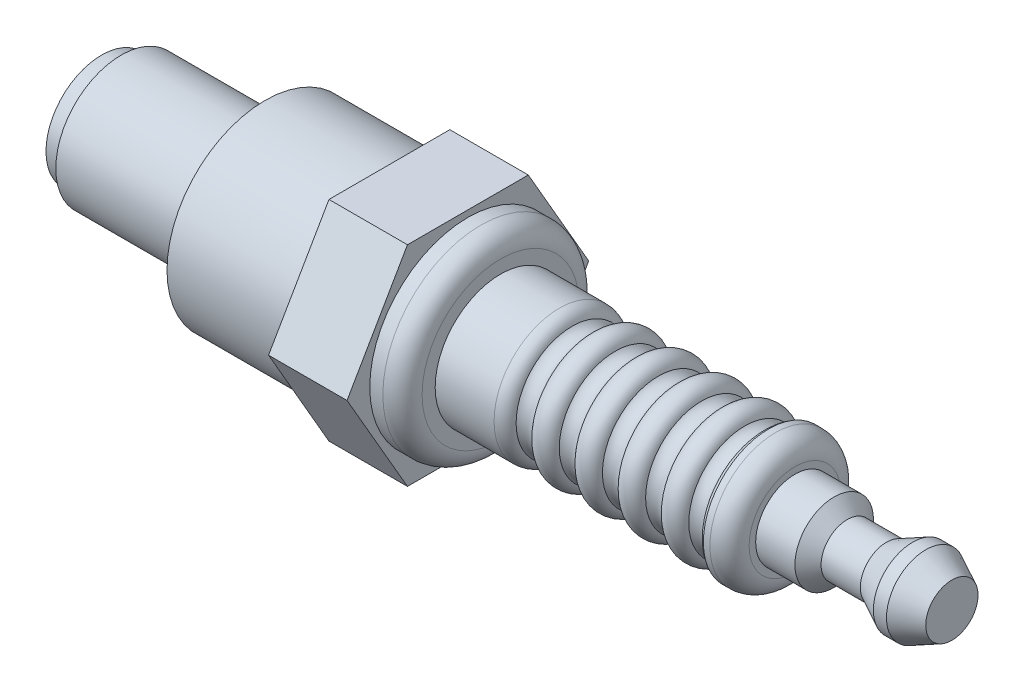
ISO-10303-21;
HEADER;
FILE_DESCRIPTION(('STEP AP214'),'2;1');
FILE_NAME('part.step','',(''),(''),'','','');
FILE_SCHEMA(('AUTOMOTIVE_DESIGN { 1 0 10303 214 1 1 1 1 }'));
ENDSEC;
DATA;
#1=APPLICATION_CONTEXT('core data for automotive mechanical design processes');
#2=APPLICATION_PROTOCOL_DEFINITION('international standard','automotive_design',2000,#1);
#3=PRODUCT_CONTEXT('',#1,'mechanical');
#4=PRODUCT('Part','Part','',(#3));
#5=PRODUCT_RELATED_PRODUCT_CATEGORY('part','',(#4));
#6=PRODUCT_DEFINITION_FORMATION('','',#4);
#7=PRODUCT_DEFINITION_CONTEXT('part definition',#1,'design');
#8=PRODUCT_DEFINITION('design','',#6,#7);
#9=PRODUCT_DEFINITION_SHAPE('','',#8);
#10=(LENGTH_UNIT() NAMED_UNIT(*) SI_UNIT(.MILLI.,.METRE.));
#11=(NAMED_UNIT(*) PLANE_ANGLE_UNIT() SI_UNIT($,.RADIAN.));
#12=(NAMED_UNIT(*) SI_UNIT($,.STERADIAN.) SOLID_ANGLE_UNIT());
#13=UNCERTAINTY_MEASURE_WITH_UNIT(LENGTH_MEASURE(1.E-05),#10,'distance_accuracy_value','');
#14=(GEOMETRIC_REPRESENTATION_CONTEXT(3) GLOBAL_UNCERTAINTY_ASSIGNED_CONTEXT((#13)) GLOBAL_UNIT_ASSIGNED_CONTEXT((#10,
#11,#12)) REPRESENTATION_CONTEXT('',''));
#15=CARTESIAN_POINT('',(0.,0.,0.));
#16=DIRECTION('',(0.,0.,1.));
#17=DIRECTION('',(1.,0.,0.));
#18=AXIS2_PLACEMENT_3D('',#15,#16,#17);
#19=CARTESIAN_POINT('',(-10.,0.,0.));
#20=DIRECTION('',(-1.,0.,0.));
#21=DIRECTION('',(0.,0.,1.));
#22=AXIS2_PLACEMENT_3D('',#19,#20,#21);
#23=CYLINDRICAL_SURFACE('',#22,7.5);
#24=CARTESIAN_POINT('',(29.,0.,0.));
#25=DIRECTION('',(-1.,0.,0.));
#26=DIRECTION('',(0.,0.,1.));
#27=AXIS2_PLACEMENT_3D('',#24,#25,#26);
#28=CIRCLE('',#27,7.5);
#29=CARTESIAN_POINT('',(29.,0.,7.49999999999997));
#30=VERTEX_POINT('',#29);
#31=EDGE_CURVE('E212',#30,#30,#28,.T.);
#32=ORIENTED_EDGE('',*,*,#31,.T.);
#33=EDGE_LOOP('',(#32));
#34=FACE_BOUND('',#33,.T.);
#35=CARTESIAN_POINT('',(28.,0.,0.));
#36=DIRECTION('',(-1.,0.,0.));
#37=DIRECTION('',(0.,0.,1.));
#38=AXIS2_PLACEMENT_3D('',#35,#36,#37);
#39=CIRCLE('',#38,7.5);
#40=CARTESIAN_POINT('',(28.,0.,7.49999999999997));
#41=VERTEX_POINT('',#40);
#42=EDGE_CURVE('E11',#41,#41,#39,.T.);
#43=ORIENTED_EDGE('',*,*,#42,.F.);
#44=EDGE_LOOP('',(#43));
#45=FACE_BOUND('',#44,.T.);
#46=ADVANCED_FACE('F36',(#34,#45),#23,.T.);
#47=CARTESIAN_POINT('',(-10.,0.,0.));
#48=DIRECTION('',(-1.,0.,0.));
#49=DIRECTION('',(0.,0.,1.));
#50=AXIS2_PLACEMENT_3D('',#47,#48,#49);
#51=CYLINDRICAL_SURFACE('',#50,3.);
#52=CARTESIAN_POINT('',(53.,0.,0.));
#53=DIRECTION('',(-1.,0.,0.));
#54=DIRECTION('',(0.,0.,1.));
#55=AXIS2_PLACEMENT_3D('',#52,#53,#54);
#56=CIRCLE('',#55,3.);
#57=CARTESIAN_POINT('',(53.,0.,2.99999999999999));
#58=VERTEX_POINT('',#57);
#59=EDGE_CURVE('E44',#58,#58,#56,.T.);
#60=ORIENTED_EDGE('',*,*,#59,.F.);
#61=EDGE_LOOP('',(#60));
#62=FACE_BOUND('',#61,.T.);
#63=CARTESIAN_POINT('',(56.0000000000001,0.,0.));
#64=DIRECTION('',(-1.,0.,0.));
#65=DIRECTION('',(0.,0.,1.));
#66=AXIS2_PLACEMENT_3D('',#63,#64,#65);
#67=CIRCLE('',#66,3.);
#68=CARTESIAN_POINT('',(56.0000000000001,0.,2.99999999999997));
#69=VERTEX_POINT('',#68);
#70=EDGE_CURVE('E143',#69,#69,#67,.T.);
#71=ORIENTED_EDGE('',*,*,#70,.T.);
#72=EDGE_LOOP('',(#71));
#73=FACE_BOUND('',#72,.T.);
#74=ADVANCED_FACE('F243',(#62,#73),#51,.T.);
#75=CARTESIAN_POINT('',(-10.,0.,0.));
#76=DIRECTION('',(-1.,0.,0.));
#77=DIRECTION('',(0.,0.,1.));
#78=AXIS2_PLACEMENT_3D('',#75,#76,#77);
#79=CYLINDRICAL_SURFACE('',#78,5.);
#80=CARTESIAN_POINT('',(35.,0.,0.));
#81=DIRECTION('',(-1.,0.,0.));
#82=DIRECTION('',(0.,0.,1.));
#83=AXIS2_PLACEMENT_3D('',#80,#81,#82);
#84=CIRCLE('',#83,5.);
#85=CARTESIAN_POINT('',(35.,0.,5.));
#86=VERTEX_POINT('',#85);
#87=EDGE_CURVE('E170',#86,#86,#84,.T.);
#88=ORIENTED_EDGE('',*,*,#87,.T.);
#89=EDGE_LOOP('',(#88));
#90=FACE_BOUND('',#89,.T.);
#91=CARTESIAN_POINT('',(30.5,0.,0.));
#92=DIRECTION('',(-1.,0.,0.));
#93=DIRECTION('',(0.,0.,1.));
#94=AXIS2_PLACEMENT_3D('',#91,#92,#93);
#95=CIRCLE('',#94,5.);
#96=CARTESIAN_POINT('',(30.5,0.,5.));
#97=VERTEX_POINT('',#96);
#98=EDGE_CURVE('E218',#97,#97,#95,.T.);
#99=ORIENTED_EDGE('',*,*,#98,.F.);
#100=EDGE_LOOP('',(#99));
#101=FACE_BOUND('',#100,.T.);
#102=ADVANCED_FACE('F249',(#90,#101),#79,.T.);
#103=CARTESIAN_POINT('',(30.5,5.99999999999999,0.));
#104=DIRECTION('',(-1.,0.,0.));
#105=DIRECTION('',(0.,0.,1.));
#106=AXIS2_PLACEMENT_3D('',#103,#104,#105);
#107=PLANE('',#106);
#108=CARTESIAN_POINT('',(30.5,0.,0.));
#109=DIRECTION('',(-1.,0.,0.));
#110=DIRECTION('',(0.,0.,1.));
#111=AXIS2_PLACEMENT_3D('',#108,#109,#110);
#112=CIRCLE('',#111,6.);
#113=CARTESIAN_POINT('',(30.5,0.,6.));
#114=VERTEX_POINT('',#113);
#115=EDGE_CURVE('E215',#114,#114,#112,.T.);
#116=ORIENTED_EDGE('',*,*,#115,.F.);
#117=EDGE_LOOP('',(#116));
#118=FACE_BOUND('',#117,.T.);
#119=ORIENTED_EDGE('',*,*,#98,.T.);
#120=EDGE_LOOP('',(#119));
#121=FACE_BOUND('',#120,.T.);
#122=ADVANCED_FACE('F431',(#118,#121),#107,.F.);
#123=CARTESIAN_POINT('',(29.,0.,0.));
#124=DIRECTION('',(-1.,0.,0.));
#125=DIRECTION('',(0.,0.,1.));
#126=AXIS2_PLACEMENT_3D('',#123,#124,#125);
#127=TOROIDAL_SURFACE('',#126,6.,1.5);
#128=ORIENTED_EDGE('',*,*,#31,.F.);
#129=EDGE_LOOP('',(#128));
#130=FACE_BOUND('',#129,.T.);
#131=ORIENTED_EDGE('',*,*,#115,.T.);
#132=EDGE_LOOP('',(#131));
#133=FACE_BOUND('',#132,.T.);
#134=ADVANCED_FACE('F293',(#130,#133),#127,.T.);
#135=CARTESIAN_POINT('',(41.6,0.,0.));
#136=DIRECTION('',(-1.,0.,0.));
#137=DIRECTION('',(0.,0.,1.));
#138=AXIS2_PLACEMENT_3D('',#135,#136,#137);
#139=TOROIDAL_SURFACE('',#138,4.,1.);
#140=CARTESIAN_POINT('',(42.5615161855068,0.,0.));
#141=DIRECTION('',(-1.,0.,0.));
#142=DIRECTION('',(0.,0.,1.));
#143=AXIS2_PLACEMENT_3D('',#140,#141,#142);
#144=CIRCLE('',#143,4.2747482939139);
#145=CARTESIAN_POINT('',(42.5615161855068,0.,4.27474829391389));
#146=VERTEX_POINT('',#145);
#147=EDGE_CURVE('E191',#146,#146,#144,.T.);
#148=ORIENTED_EDGE('',*,*,#147,.T.);
#149=EDGE_LOOP('',(#148));
#150=FACE_BOUND('',#149,.T.);
#151=CARTESIAN_POINT('',(40.6384838144933,0.,0.));
#152=DIRECTION('',(-1.,0.,0.));
#153=DIRECTION('',(0.,0.,1.));
#154=AXIS2_PLACEMENT_3D('',#151,#152,#153);
#155=CIRCLE('',#154,4.27474829391391);
#156=CARTESIAN_POINT('',(40.6384838144933,0.,4.27474829391389));
#157=VERTEX_POINT('',#156);
#158=EDGE_CURVE('E194',#157,#157,#155,.T.);
#159=ORIENTED_EDGE('',*,*,#158,.F.);
#160=EDGE_LOOP('',(#159));
#161=FACE_BOUND('',#160,.T.);
#162=ADVANCED_FACE('F289',(#150,#161),#139,.T.);
#163=CARTESIAN_POINT('',(44.9,0.,0.));
#164=DIRECTION('',(-1.,0.,0.));
#165=DIRECTION('',(0.,0.,1.));
#166=AXIS2_PLACEMENT_3D('',#163,#164,#165);
#167=TOROIDAL_SURFACE('',#166,4.,1.);
#168=CARTESIAN_POINT('',(45.8615161855067,0.,0.));
#169=DIRECTION('',(-1.,0.,0.));
#170=DIRECTION('',(0.,0.,1.));
#171=AXIS2_PLACEMENT_3D('',#168,#169,#170);
#172=CIRCLE('',#171,4.2747482939139);
#173=CARTESIAN_POINT('',(45.8615161855067,0.,4.2747482939139));
#174=VERTEX_POINT('',#173);
#175=EDGE_CURVE('E185',#174,#174,#172,.T.);
#176=ORIENTED_EDGE('',*,*,#175,.T.);
#177=EDGE_LOOP('',(#176));
#178=FACE_BOUND('',#177,.T.);
#179=CARTESIAN_POINT('',(43.9384838144933,0.,0.));
#180=DIRECTION('',(-1.,0.,0.));
#181=DIRECTION('',(0.,0.,1.));
#182=AXIS2_PLACEMENT_3D('',#179,#180,#181);
#183=CIRCLE('',#182,4.27474829391391);
#184=CARTESIAN_POINT('',(43.9384838144933,0.,4.27474829391387));
#185=VERTEX_POINT('',#184);
#186=EDGE_CURVE('E188',#185,#185,#183,.T.);
#187=ORIENTED_EDGE('',*,*,#186,.F.);
#188=EDGE_LOOP('',(#187));
#189=FACE_BOUND('',#188,.T.);
#190=ADVANCED_FACE('F292',(#178,#189),#167,.T.);
#191=CARTESIAN_POINT('',(48.2,0.,0.));
#192=DIRECTION('',(-1.,0.,0.));
#193=DIRECTION('',(0.,0.,1.));
#194=AXIS2_PLACEMENT_3D('',#191,#192,#193);
#195=TOROIDAL_SURFACE('',#194,4.,1.);
#196=CARTESIAN_POINT('',(49.1615161855068,0.,0.));
#197=DIRECTION('',(-1.,0.,0.));
#198=DIRECTION('',(0.,0.,1.));
#199=AXIS2_PLACEMENT_3D('',#196,#197,#198);
#200=CIRCLE('',#199,4.2747482939139);
#201=CARTESIAN_POINT('',(49.1615161855068,0.,4.27474829391387));
#202=VERTEX_POINT('',#201);
#203=EDGE_CURVE('E179',#202,#202,#200,.T.);
#204=ORIENTED_EDGE('',*,*,#203,.T.);
#205=EDGE_LOOP('',(#204));
#206=FACE_BOUND('',#205,.T.);
#207=CARTESIAN_POINT('',(47.2384838144933,0.,0.));
#208=DIRECTION('',(-1.,0.,0.));
#209=DIRECTION('',(0.,0.,1.));
#210=AXIS2_PLACEMENT_3D('',#207,#208,#209);
#211=CIRCLE('',#210,4.27474829391391);
#212=CARTESIAN_POINT('',(47.2384838144933,0.,4.27474829391387));
#213=VERTEX_POINT('',#212);
#214=EDGE_CURVE('E182',#213,#213,#211,.T.);
#215=ORIENTED_EDGE('',*,*,#214,.F.);
#216=EDGE_LOOP('',(#215));
#217=FACE_BOUND('',#216,.T.);
#218=ADVANCED_FACE('F301',(#206,#217),#195,.T.);
#219=CARTESIAN_POINT('',(38.3,0.,0.));
#220=DIRECTION('',(-1.,0.,0.));
#221=DIRECTION('',(0.,0.,1.));
#222=AXIS2_PLACEMENT_3D('',#219,#220,#221);
#223=TOROIDAL_SURFACE('',#222,4.,1.);
#224=CARTESIAN_POINT('',(39.2615161855067,0.,0.));
#225=DIRECTION('',(-1.,0.,0.));
#226=DIRECTION('',(0.,0.,1.));
#227=AXIS2_PLACEMENT_3D('',#224,#225,#226);
#228=CIRCLE('',#227,4.2747482939139);
#229=CARTESIAN_POINT('',(39.2615161855067,0.,4.2747482939139));
#230=VERTEX_POINT('',#229);
#231=EDGE_CURVE('E161',#230,#230,#228,.T.);
#232=ORIENTED_EDGE('',*,*,#231,.T.);
#233=EDGE_LOOP('',(#232));
#234=FACE_BOUND('',#233,.T.);
#235=CARTESIAN_POINT('',(37.3384838144933,0.,0.));
#236=DIRECTION('',(-1.,0.,0.));
#237=DIRECTION('',(0.,0.,1.));
#238=AXIS2_PLACEMENT_3D('',#235,#236,#237);
#239=CIRCLE('',#238,4.27474829391391);
#240=CARTESIAN_POINT('',(37.3384838144933,0.,4.2747482939139));
#241=VERTEX_POINT('',#240);
#242=EDGE_CURVE('E164',#241,#241,#239,.T.);
#243=ORIENTED_EDGE('',*,*,#242,.F.);
#244=EDGE_LOOP('',(#243));
#245=FACE_BOUND('',#244,.T.);
#246=ADVANCED_FACE('F287',(#234,#245),#223,.T.);
#247=CARTESIAN_POINT('',(39.95,0.,0.));
#248=DIRECTION('',(-1.,0.,0.));
#249=DIRECTION('',(0.,0.,1.));
#250=AXIS2_PLACEMENT_3D('',#247,#248,#249);
#251=TOROIDAL_SURFACE('',#250,5.,0.999999999999998);
#252=ORIENTED_EDGE('',*,*,#158,.T.);
#253=EDGE_LOOP('',(#252));
#254=FACE_BOUND('',#253,.T.);
#255=ORIENTED_EDGE('',*,*,#231,.F.);
#256=EDGE_LOOP('',(#255));
#257=FACE_BOUND('',#256,.T.);
#258=ADVANCED_FACE('F283',(#254,#257),#251,.F.);
#259=CARTESIAN_POINT('',(43.25,0.,0.));
#260=DIRECTION('',(-1.,0.,0.));
#261=DIRECTION('',(0.,0.,1.));
#262=AXIS2_PLACEMENT_3D('',#259,#260,#261);
#263=TOROIDAL_SURFACE('',#262,5.,1.);
#264=ORIENTED_EDGE('',*,*,#186,.T.);
#265=EDGE_LOOP('',(#264));
#266=FACE_BOUND('',#265,.T.);
#267=ORIENTED_EDGE('',*,*,#147,.F.);
#268=EDGE_LOOP('',(#267));
#269=FACE_BOUND('',#268,.T.);
#270=ADVANCED_FACE('F286',(#266,#269),#263,.F.);
#271=CARTESIAN_POINT('',(46.55,0.,0.));
#272=DIRECTION('',(-1.,0.,0.));
#273=DIRECTION('',(0.,0.,1.));
#274=AXIS2_PLACEMENT_3D('',#271,#272,#273);
#275=TOROIDAL_SURFACE('',#274,5.,0.999999999999998);
#276=ORIENTED_EDGE('',*,*,#214,.T.);
#277=EDGE_LOOP('',(#276));
#278=FACE_BOUND('',#277,.T.);
#279=ORIENTED_EDGE('',*,*,#175,.F.);
#280=EDGE_LOOP('',(#279));
#281=FACE_BOUND('',#280,.T.);
#282=ADVANCED_FACE('F297',(#278,#281),#275,.F.);
#283=CARTESIAN_POINT('',(49.85,0.,0.));
#284=DIRECTION('',(-1.,0.,0.));
#285=DIRECTION('',(0.,0.,1.));
#286=AXIS2_PLACEMENT_3D('',#283,#284,#285);
#287=TOROIDAL_SURFACE('',#286,5.,1.);
#288=CARTESIAN_POINT('',(50.3935656708925,0.,0.));
#289=DIRECTION('',(-1.,0.,0.));
#290=DIRECTION('',(0.,0.,1.));
#291=AXIS2_PLACEMENT_3D('',#288,#289,#290);
#292=CIRCLE('',#291,4.16063335697249);
#293=CARTESIAN_POINT('',(50.3935656708925,0.,4.16063335697247));
#294=VERTEX_POINT('',#293);
#295=EDGE_CURVE('E176',#294,#294,#292,.T.);
#296=ORIENTED_EDGE('',*,*,#295,.T.);
#297=EDGE_LOOP('',(#296));
#298=FACE_BOUND('',#297,.T.);
#299=ORIENTED_EDGE('',*,*,#203,.F.);
#300=EDGE_LOOP('',(#299));
#301=FACE_BOUND('',#300,.T.);
#302=ADVANCED_FACE('F305',(#298,#301),#287,.F.);
#303=CARTESIAN_POINT('',(51.5,0.,0.));
#304=DIRECTION('',(-1.,0.,0.));
#305=DIRECTION('',(0.,0.,1.));
#306=AXIS2_PLACEMENT_3D('',#303,#304,#305);
#307=TOROIDAL_SURFACE('',#306,4.,1.11803398874989);
#308=CARTESIAN_POINT('',(51.,0.,0.));
#309=DIRECTION('',(-1.,0.,0.));
#310=DIRECTION('',(0.,0.,1.));
#311=AXIS2_PLACEMENT_3D('',#308,#309,#310);
#312=CIRCLE('',#311,5.);
#313=CARTESIAN_POINT('',(51.,0.,4.99999999999997));
#314=VERTEX_POINT('',#313);
#315=EDGE_CURVE('E173',#314,#314,#312,.T.);
#316=ORIENTED_EDGE('',*,*,#315,.T.);
#317=EDGE_LOOP('',(#316));
#318=FACE_BOUND('',#317,.T.);
#319=ORIENTED_EDGE('',*,*,#295,.F.);
#320=EDGE_LOOP('',(#319));
#321=FACE_BOUND('',#320,.T.);
#322=ADVANCED_FACE('F312',(#318,#321),#307,.T.);
#323=CARTESIAN_POINT('',(35.,0.,0.));
#324=DIRECTION('',(-1.,0.,0.));
#325=DIRECTION('',(0.,0.,1.));
#326=AXIS2_PLACEMENT_3D('',#323,#324,#325);
#327=TOROIDAL_SURFACE('',#326,4.,0.999999999999997);
#328=CARTESIAN_POINT('',(35.9615161855067,0.,0.));
#329=DIRECTION('',(-1.,0.,0.));
#330=DIRECTION('',(0.,0.,1.));
#331=AXIS2_PLACEMENT_3D('',#328,#329,#330);
#332=CIRCLE('',#331,4.27474829391392);
#333=CARTESIAN_POINT('',(35.9615161855067,0.,4.27474829391392));
#334=VERTEX_POINT('',#333);
#335=EDGE_CURVE('E167',#334,#334,#332,.T.);
#336=ORIENTED_EDGE('',*,*,#335,.T.);
#337=EDGE_LOOP('',(#336));
#338=FACE_BOUND('',#337,.T.);
#339=ORIENTED_EDGE('',*,*,#87,.F.);
#340=EDGE_LOOP('',(#339));
#341=FACE_BOUND('',#340,.T.);
#342=ADVANCED_FACE('F316',(#338,#341),#327,.T.);
#343=CARTESIAN_POINT('',(36.65,0.,0.));
#344=DIRECTION('',(-1.,0.,0.));
#345=DIRECTION('',(0.,0.,1.));
#346=AXIS2_PLACEMENT_3D('',#343,#344,#345);
#347=TOROIDAL_SURFACE('',#346,5.,1.);
#348=ORIENTED_EDGE('',*,*,#242,.T.);
#349=EDGE_LOOP('',(#348));
#350=FACE_BOUND('',#349,.T.);
#351=ORIENTED_EDGE('',*,*,#335,.F.);
#352=EDGE_LOOP('',(#351));
#353=FACE_BOUND('',#352,.T.);
#354=ADVANCED_FACE('F320',(#350,#353),#347,.F.);
#355=CARTESIAN_POINT('',(53.,3.49999999999999,0.));
#356=DIRECTION('',(-1.,0.,0.));
#357=DIRECTION('',(0.,0.,1.));
#358=AXIS2_PLACEMENT_3D('',#355,#356,#357);
#359=PLANE('',#358);
#360=CARTESIAN_POINT('',(53.,0.,0.));
#361=DIRECTION('',(-1.,0.,0.));
#362=DIRECTION('',(0.,0.,1.));
#363=AXIS2_PLACEMENT_3D('',#360,#361,#362);
#364=CIRCLE('',#363,3.5);
#365=CARTESIAN_POINT('',(53.,0.,3.49999999999999));
#366=VERTEX_POINT('',#365);
#367=EDGE_CURVE('E224',#366,#366,#364,.T.);
#368=ORIENTED_EDGE('',*,*,#367,.F.);
#369=EDGE_LOOP('',(#368));
#370=FACE_BOUND('',#369,.T.);
#371=ORIENTED_EDGE('',*,*,#59,.T.);
#372=EDGE_LOOP('',(#371));
#373=FACE_BOUND('',#372,.T.);
#374=ADVANCED_FACE('F324',(#370,#373),#359,.F.);
#375=CARTESIAN_POINT('',(51.5,0.,0.));
#376=DIRECTION('',(-1.,0.,0.));
#377=DIRECTION('',(0.,0.,1.));
#378=AXIS2_PLACEMENT_3D('',#375,#376,#377);
#379=TOROIDAL_SURFACE('',#378,3.5,1.5);
#380=CARTESIAN_POINT('',(51.5,0.,0.));
#381=DIRECTION('',(-1.,0.,0.));
#382=DIRECTION('',(0.,0.,1.));
#383=AXIS2_PLACEMENT_3D('',#380,#381,#382);
#384=CIRCLE('',#383,5.);
#385=CARTESIAN_POINT('',(51.5,0.,4.99999999999996));
#386=VERTEX_POINT('',#385);
#387=EDGE_CURVE('E221',#386,#386,#384,.T.);
#388=ORIENTED_EDGE('',*,*,#387,.F.);
#389=EDGE_LOOP('',(#388));
#390=FACE_BOUND('',#389,.T.);
#391=ORIENTED_EDGE('',*,*,#367,.T.);
#392=EDGE_LOOP('',(#391));
#393=FACE_BOUND('',#392,.T.);
#394=ADVANCED_FACE('F446',(#390,#393),#379,.T.);
#395=ORIENTED_EDGE('',*,*,#387,.T.);
#396=EDGE_LOOP('',(#395));
#397=FACE_BOUND('',#396,.T.);
#398=ORIENTED_EDGE('',*,*,#315,.F.);
#399=EDGE_LOOP('',(#398));
#400=FACE_BOUND('',#399,.T.);
#401=ADVANCED_FACE('F337',(#397,#400),#79,.T.);
#402=CARTESIAN_POINT('',(60.,0.,0.));
#403=DIRECTION('',(1.,0.,0.));
#404=DIRECTION('',(0.,0.,-1.));
#405=AXIS2_PLACEMENT_3D('',#402,#403,#404);
#406=CONICAL_SURFACE('',#405,2.,0.463647609000806);
#407=CARTESIAN_POINT('',(62.,0.,0.));
#408=DIRECTION('',(-1.,0.,0.));
#409=DIRECTION('',(0.,0.,1.));
#410=AXIS2_PLACEMENT_3D('',#407,#408,#409);
#411=CIRCLE('',#410,3.);
#412=CARTESIAN_POINT('',(62.,0.,2.99999999999997));
#413=VERTEX_POINT('',#412);
#414=EDGE_CURVE('E152',#413,#413,#411,.T.);
#415=ORIENTED_EDGE('',*,*,#414,.T.);
#416=EDGE_LOOP('',(#415));
#417=FACE_BOUND('',#416,.T.);
#418=CARTESIAN_POINT('',(60.,0.,0.));
#419=DIRECTION('',(-1.,0.,0.));
#420=DIRECTION('',(0.,0.,1.));
#421=AXIS2_PLACEMENT_3D('',#418,#419,#420);
#422=CIRCLE('',#421,2.);
#423=CARTESIAN_POINT('',(60.,0.,1.99999999999997));
#424=VERTEX_POINT('',#423);
#425=EDGE_CURVE('E149',#424,#424,#422,.T.);
#426=ORIENTED_EDGE('',*,*,#425,.F.);
#427=EDGE_LOOP('',(#426));
#428=FACE_BOUND('',#427,.T.);
#429=ADVANCED_FACE('F333',(#417,#428),#406,.T.);
#430=CARTESIAN_POINT('',(-7.00000000000001,0.,0.));
#431=DIRECTION('',(-1.,0.,0.));
#432=DIRECTION('',(0.,0.,1.));
#433=AXIS2_PLACEMENT_3D('',#430,#431,#432);
#434=CYLINDRICAL_SURFACE('',#433,2.);
#435=ORIENTED_EDGE('',*,*,#425,.T.);
#436=EDGE_LOOP('',(#435));
#437=FACE_BOUND('',#436,.T.);
#438=CARTESIAN_POINT('',(57.,0.,0.));
#439=DIRECTION('',(-1.,0.,0.));
#440=DIRECTION('',(0.,0.,1.));
#441=AXIS2_PLACEMENT_3D('',#438,#439,#440);
#442=CIRCLE('',#441,2.);
#443=CARTESIAN_POINT('',(57.,0.,1.99999999999996));
#444=VERTEX_POINT('',#443);
#445=EDGE_CURVE('E146',#444,#444,#442,.T.);
#446=ORIENTED_EDGE('',*,*,#445,.F.);
#447=EDGE_LOOP('',(#446));
#448=FACE_BOUND('',#447,.T.);
#449=ADVANCED_FACE('F336',(#437,#448),#434,.T.);
#450=CARTESIAN_POINT('',(56.0000000000001,0.,0.));
#451=DIRECTION('',(-1.,0.,0.));
#452=DIRECTION('',(0.,0.,1.));
#453=AXIS2_PLACEMENT_3D('',#450,#451,#452);
#454=CONICAL_SURFACE('',#453,3.,0.785398163397448);
#455=ORIENTED_EDGE('',*,*,#445,.T.);
#456=EDGE_LOOP('',(#455));
#457=FACE_BOUND('',#456,.T.);
#458=ORIENTED_EDGE('',*,*,#70,.F.);
#459=EDGE_LOOP('',(#458));
#460=FACE_BOUND('',#459,.T.);
#461=ADVANCED_FACE('F341',(#457,#460),#454,.T.);
#462=ORIENTED_EDGE('',*,*,#414,.F.);
#463=EDGE_LOOP('',(#462));
#464=FACE_BOUND('',#463,.T.);
#465=CARTESIAN_POINT('',(63.0000000000001,0.,0.));
#466=DIRECTION('',(-1.,0.,0.));
#467=DIRECTION('',(0.,0.,1.));
#468=AXIS2_PLACEMENT_3D('',#465,#466,#467);
#469=CIRCLE('',#468,3.);
#470=CARTESIAN_POINT('',(63.0000000000001,0.,2.99999999999994));
#471=VERTEX_POINT('',#470);
#472=EDGE_CURVE('E155',#471,#471,#469,.T.);
#473=ORIENTED_EDGE('',*,*,#472,.T.);
#474=EDGE_LOOP('',(#473));
#475=FACE_BOUND('',#474,.T.);
#476=ADVANCED_FACE('F251',(#464,#475),#51,.T.);
#477=CARTESIAN_POINT('',(63.0000000000001,0.,0.));
#478=DIRECTION('',(-1.,0.,0.));
#479=DIRECTION('',(0.,0.,1.));
#480=AXIS2_PLACEMENT_3D('',#477,#478,#479);
#481=CONICAL_SURFACE('',#480,3.,0.463647609000806);
#482=CARTESIAN_POINT('',(65.0000000000001,0.,0.));
#483=DIRECTION('',(-1.,0.,0.));
#484=DIRECTION('',(0.,0.,1.));
#485=AXIS2_PLACEMENT_3D('',#482,#483,#484);
#486=CIRCLE('',#485,2.);
#487=CARTESIAN_POINT('',(65.0000000000001,0.,1.99999999999994));
#488=VERTEX_POINT('',#487);
#489=EDGE_CURVE('E158',#488,#488,#486,.T.);
#490=ORIENTED_EDGE('',*,*,#489,.T.);
#491=EDGE_LOOP('',(#490));
#492=FACE_BOUND('',#491,.T.);
#493=ORIENTED_EDGE('',*,*,#472,.F.);
#494=EDGE_LOOP('',(#493));
#495=FACE_BOUND('',#494,.T.);
#496=ADVANCED_FACE('F329',(#492,#495),#481,.T.);
#497=CARTESIAN_POINT('',(65.,2.99999999999999,0.));
#498=DIRECTION('',(-1.,0.,0.));
#499=DIRECTION('',(0.,0.,1.));
#500=AXIS2_PLACEMENT_3D('',#497,#498,#499);
#501=PLANE('',#500);
#502=ORIENTED_EDGE('',*,*,#489,.F.);
#503=EDGE_LOOP('',(#502));
#504=FACE_BOUND('',#503,.T.);
#505=ADVANCED_FACE('F38',(#504),#501,.F.);
#506=CARTESIAN_POINT('',(28.,15.9999999999999,-1.38777878078145E-13));
#507=DIRECTION('',(-1.,0.,0.));
#508=DIRECTION('',(0.,0.,1.));
#509=AXIS2_PLACEMENT_3D('',#506,#507,#508);
#510=PLANE('',#509);
#511=DIRECTION('',(0.,-0.866025403784433,0.50000000000001));
#512=VECTOR('',#511,1.);
#513=CARTESIAN_POINT('',(28.,0.,9.23760430703399));
#514=LINE('',#513,#512);
#515=CARTESIAN_POINT('',(28.,8.,4.61880215351693));
#516=VERTEX_POINT('',#515);
#517=CARTESIAN_POINT('',(28.,0.,9.23760430703399));
#518=VERTEX_POINT('',#517);
#519=EDGE_CURVE('E123',#516,#518,#514,.T.);
#520=ORIENTED_EDGE('',*,*,#519,.T.);
#521=DIRECTION('',(0.,-0.866025403784443,-0.499999999999992));
#522=VECTOR('',#521,1.);
#523=CARTESIAN_POINT('',(28.,-7.99999999999998,4.61880215351704));
#524=LINE('',#523,#522);
#525=CARTESIAN_POINT('',(28.,-7.99999999999998,4.61880215351704));
#526=VERTEX_POINT('',#525);
#527=EDGE_CURVE('E105',#518,#526,#524,.T.);
#528=ORIENTED_EDGE('',*,*,#527,.T.);
#529=DIRECTION('',(0.,0.,-1.));
#530=VECTOR('',#529,1.);
#531=CARTESIAN_POINT('',(28.,-8.00000000000004,-4.618802153517));
#532=LINE('',#531,#530);
#533=CARTESIAN_POINT('',(28.,-8.00000000000004,-4.618802153517));
#534=VERTEX_POINT('',#533);
#535=EDGE_CURVE('E126',#526,#534,#532,.T.);
#536=ORIENTED_EDGE('',*,*,#535,.T.);
#537=DIRECTION('',(0.,0.866025403784436,-0.500000000000004));
#538=VECTOR('',#537,1.);
#539=CARTESIAN_POINT('',(28.,0.,-9.23760430703402));
#540=LINE('',#539,#538);
#541=CARTESIAN_POINT('',(28.,0.,-9.23760430703402));
#542=VERTEX_POINT('',#541);
#543=EDGE_CURVE('E128',#534,#542,#540,.T.);
#544=ORIENTED_EDGE('',*,*,#543,.T.);
#545=DIRECTION('',(0.,0.86602540378444,0.499999999999998));
#546=VECTOR('',#545,1.);
#547=CARTESIAN_POINT('',(28.,8.,-4.61880215351707));
#548=LINE('',#547,#546);
#549=CARTESIAN_POINT('',(28.,8.,-4.61880215351707));
#550=VERTEX_POINT('',#549);
#551=EDGE_CURVE('E56',#542,#550,#548,.T.);
#552=ORIENTED_EDGE('',*,*,#551,.T.);
#553=DIRECTION('',(0.,0.,1.));
#554=VECTOR('',#553,1.);
#555=CARTESIAN_POINT('',(28.,8.,4.61880215351693));
#556=LINE('',#555,#554);
#557=EDGE_CURVE('E51',#550,#516,#556,.T.);
#558=ORIENTED_EDGE('',*,*,#557,.T.);
#559=EDGE_LOOP('',(#520,#528,#536,#544,#552,#558));
#560=FACE_BOUND('',#559,.T.);
#561=ORIENTED_EDGE('',*,*,#42,.T.);
#562=EDGE_LOOP('',(#561));
#563=FACE_BOUND('',#562,.T.);
#564=ADVANCED_FACE('F234',(#560,#563),#510,.F.);
#565=CARTESIAN_POINT('',(22.,15.9999999999999,-1.38777878078145E-13));
#566=DIRECTION('',(-1.,0.,0.));
#567=DIRECTION('',(0.,0.,1.));
#568=AXIS2_PLACEMENT_3D('',#565,#566,#567);
#569=PLANE('',#568);
#570=DIRECTION('',(0.,-0.866025403784433,0.50000000000001));
#571=VECTOR('',#570,1.);
#572=CARTESIAN_POINT('',(22.,0.,9.23760430703402));
#573=LINE('',#572,#571);
#574=CARTESIAN_POINT('',(22.,7.99999999999999,4.61880215351691));
#575=VERTEX_POINT('',#574);
#576=CARTESIAN_POINT('',(22.,0.,9.23760430703402));
#577=VERTEX_POINT('',#576);
#578=EDGE_CURVE('E95',#575,#577,#573,.T.);
#579=ORIENTED_EDGE('',*,*,#578,.F.);
#580=DIRECTION('',(0.,0.,1.));
#581=VECTOR('',#580,1.);
#582=CARTESIAN_POINT('',(22.,7.99999999999999,4.61880215351691));
#583=LINE('',#582,#581);
#584=CARTESIAN_POINT('',(22.,7.99999999999999,-4.61880215351702));
#585=VERTEX_POINT('',#584);
#586=EDGE_CURVE('E121',#585,#575,#583,.T.);
#587=ORIENTED_EDGE('',*,*,#586,.F.);
#588=DIRECTION('',(0.,0.86602540378444,0.499999999999998));
#589=VECTOR('',#588,1.);
#590=CARTESIAN_POINT('',(22.,7.99999999999999,-4.61880215351702));
#591=LINE('',#590,#589);
#592=CARTESIAN_POINT('',(22.,0.,-9.23760430703405));
#593=VERTEX_POINT('',#592);
#594=EDGE_CURVE('E119',#593,#585,#591,.T.);
#595=ORIENTED_EDGE('',*,*,#594,.F.);
#596=DIRECTION('',(0.,0.866025403784436,-0.500000000000004));
#597=VECTOR('',#596,1.);
#598=CARTESIAN_POINT('',(22.,0.,-9.23760430703405));
#599=LINE('',#598,#597);
#600=CARTESIAN_POINT('',(22.,-8.00000000000004,-4.61880215351698));
#601=VERTEX_POINT('',#600);
#602=EDGE_CURVE('E117',#601,#593,#599,.T.);
#603=ORIENTED_EDGE('',*,*,#602,.F.);
#604=DIRECTION('',(0.,0.,-1.));
#605=VECTOR('',#604,1.);
#606=CARTESIAN_POINT('',(22.,-8.00000000000004,-4.61880215351698));
#607=LINE('',#606,#605);
#608=CARTESIAN_POINT('',(22.,-7.99999999999997,4.61880215351704));
#609=VERTEX_POINT('',#608);
#610=EDGE_CURVE('E97',#609,#601,#607,.T.);
#611=ORIENTED_EDGE('',*,*,#610,.F.);
#612=DIRECTION('',(0.,-0.866025403784443,-0.499999999999992));
#613=VECTOR('',#612,1.);
#614=CARTESIAN_POINT('',(22.,-7.99999999999997,4.61880215351704));
#615=LINE('',#614,#613);
#616=EDGE_CURVE('E89',#577,#609,#615,.T.);
#617=ORIENTED_EDGE('',*,*,#616,.F.);
#618=EDGE_LOOP('',(#579,#587,#595,#603,#611,#617));
#619=FACE_BOUND('',#618,.T.);
#620=CARTESIAN_POINT('',(22.,0.,0.));
#621=DIRECTION('',(-1.,0.,0.));
#622=DIRECTION('',(0.,0.,1.));
#623=AXIS2_PLACEMENT_3D('',#620,#621,#622);
#624=CIRCLE('',#623,7.5);
#625=CARTESIAN_POINT('',(22.,0.,7.5));
#626=VERTEX_POINT('',#625);
#627=EDGE_CURVE('E108',#626,#626,#624,.T.);
#628=ORIENTED_EDGE('',*,*,#627,.F.);
#629=EDGE_LOOP('',(#628));
#630=FACE_BOUND('',#629,.T.);
#631=ADVANCED_FACE('F91',(#619,#630),#569,.T.);
#632=CARTESIAN_POINT('',(28.,0.,9.23760430703399));
#633=DIRECTION('',(0.,-0.50000000000001,-0.866025403784432));
#634=DIRECTION('',(0.,0.866025403784433,-0.50000000000001));
#635=AXIS2_PLACEMENT_3D('',#632,#633,#634);
#636=PLANE('',#635);
#637=ORIENTED_EDGE('',*,*,#578,.T.);
#638=DIRECTION('',(-1.,0.,0.));
#639=VECTOR('',#638,1.);
#640=CARTESIAN_POINT('',(28.,0.,9.23760430703399));
#641=LINE('',#640,#639);
#642=EDGE_CURVE('E103',#518,#577,#641,.T.);
#643=ORIENTED_EDGE('',*,*,#642,.F.);
#644=ORIENTED_EDGE('',*,*,#519,.F.);
#645=DIRECTION('',(-1.,0.,0.));
#646=VECTOR('',#645,1.);
#647=CARTESIAN_POINT('',(28.,8.,4.61880215351693));
#648=LINE('',#647,#646);
#649=EDGE_CURVE('E113',#516,#575,#648,.T.);
#650=ORIENTED_EDGE('',*,*,#649,.T.);
#651=EDGE_LOOP('',(#637,#643,#644,#650));
#652=FACE_BOUND('',#651,.T.);
#653=ADVANCED_FACE('F112',(#652),#636,.F.);
#654=CARTESIAN_POINT('',(28.,-7.99999999999998,4.61880215351704));
#655=DIRECTION('',(0.,0.499999999999992,-0.866025403784443));
#656=DIRECTION('',(0.,0.866025403784443,0.499999999999992));
#657=AXIS2_PLACEMENT_3D('',#654,#655,#656);
#658=PLANE('',#657);
#659=ORIENTED_EDGE('',*,*,#616,.T.);
#660=DIRECTION('',(-1.,0.,0.));
#661=VECTOR('',#660,1.);
#662=CARTESIAN_POINT('',(28.,-7.99999999999998,4.61880215351704));
#663=LINE('',#662,#661);
#664=EDGE_CURVE('E109',#526,#609,#663,.T.);
#665=ORIENTED_EDGE('',*,*,#664,.F.);
#666=ORIENTED_EDGE('',*,*,#527,.F.);
#667=ORIENTED_EDGE('',*,*,#642,.T.);
#668=EDGE_LOOP('',(#659,#665,#666,#667));
#669=FACE_BOUND('',#668,.T.);
#670=ADVANCED_FACE('F104',(#669),#658,.F.);
#671=CARTESIAN_POINT('',(28.,-8.00000000000004,-4.618802153517));
#672=DIRECTION('',(0.,1.,0.));
#673=DIRECTION('',(0.,0.,1.));
#674=AXIS2_PLACEMENT_3D('',#671,#672,#673);
#675=PLANE('',#674);
#676=ORIENTED_EDGE('',*,*,#610,.T.);
#677=DIRECTION('',(-1.,0.,0.));
#678=VECTOR('',#677,1.);
#679=CARTESIAN_POINT('',(28.,-8.00000000000004,-4.618802153517));
#680=LINE('',#679,#678);
#681=EDGE_CURVE('E139',#534,#601,#680,.T.);
#682=ORIENTED_EDGE('',*,*,#681,.F.);
#683=ORIENTED_EDGE('',*,*,#535,.F.);
#684=ORIENTED_EDGE('',*,*,#664,.T.);
#685=EDGE_LOOP('',(#676,#682,#683,#684));
#686=FACE_BOUND('',#685,.T.);
#687=ADVANCED_FACE('F348',(#686),#675,.F.);
#688=CARTESIAN_POINT('',(28.,0.,-9.23760430703402));
#689=DIRECTION('',(0.,0.500000000000004,0.866025403784436));
#690=DIRECTION('',(0.,-0.866025403784437,0.500000000000004));
#691=AXIS2_PLACEMENT_3D('',#688,#689,#690);
#692=PLANE('',#691);
#693=ORIENTED_EDGE('',*,*,#602,.T.);
#694=DIRECTION('',(-1.,0.,0.));
#695=VECTOR('',#694,1.);
#696=CARTESIAN_POINT('',(28.,0.,-9.23760430703402));
#697=LINE('',#696,#695);
#698=EDGE_CURVE('E136',#542,#593,#697,.T.);
#699=ORIENTED_EDGE('',*,*,#698,.F.);
#700=ORIENTED_EDGE('',*,*,#543,.F.);
#701=ORIENTED_EDGE('',*,*,#681,.T.);
#702=EDGE_LOOP('',(#693,#699,#700,#701));
#703=FACE_BOUND('',#702,.T.);
#704=ADVANCED_FACE('F351',(#703),#692,.F.);
#705=CARTESIAN_POINT('',(28.,8.,-4.61880215351707));
#706=DIRECTION('',(0.,-0.499999999999998,0.86602540378444));
#707=DIRECTION('',(0.,-0.86602540378444,-0.499999999999998));
#708=AXIS2_PLACEMENT_3D('',#705,#706,#707);
#709=PLANE('',#708);
#710=ORIENTED_EDGE('',*,*,#594,.T.);
#711=DIRECTION('',(-1.,0.,0.));
#712=VECTOR('',#711,1.);
#713=CARTESIAN_POINT('',(28.,8.,-4.61880215351707));
#714=LINE('',#713,#712);
#715=EDGE_CURVE('E133',#550,#585,#714,.T.);
#716=ORIENTED_EDGE('',*,*,#715,.F.);
#717=ORIENTED_EDGE('',*,*,#551,.F.);
#718=ORIENTED_EDGE('',*,*,#698,.T.);
#719=EDGE_LOOP('',(#710,#716,#717,#718));
#720=FACE_BOUND('',#719,.T.);
#721=ADVANCED_FACE('F355',(#720),#709,.F.);
#722=CARTESIAN_POINT('',(28.,8.,4.61880215351693));
#723=DIRECTION('',(0.,-1.,0.));
#724=DIRECTION('',(0.,0.,-1.));
#725=AXIS2_PLACEMENT_3D('',#722,#723,#724);
#726=PLANE('',#725);
#727=ORIENTED_EDGE('',*,*,#586,.T.);
#728=ORIENTED_EDGE('',*,*,#649,.F.);
#729=ORIENTED_EDGE('',*,*,#557,.F.);
#730=ORIENTED_EDGE('',*,*,#715,.T.);
#731=EDGE_LOOP('',(#727,#728,#729,#730));
#732=FACE_BOUND('',#731,.T.);
#733=ADVANCED_FACE('F281',(#732),#726,.F.);
#734=CARTESIAN_POINT('',(0.,0.,0.));
#735=DIRECTION('',(1.,0.,0.));
#736=DIRECTION('',(0.,0.,-1.));
#737=AXIS2_PLACEMENT_3D('',#734,#735,#736);
#738=PLANE('',#737);
#739=CARTESIAN_POINT('',(0.,0.,0.));
#740=DIRECTION('',(-1.,0.,0.));
#741=DIRECTION('',(0.,0.,1.));
#742=AXIS2_PLACEMENT_3D('',#739,#740,#741);
#743=CIRCLE('',#742,4.25);
#744=CARTESIAN_POINT('',(0.,0.,4.25));
#745=VERTEX_POINT('',#744);
#746=EDGE_CURVE('E197',#745,#745,#743,.T.);
#747=ORIENTED_EDGE('',*,*,#746,.T.);
#748=EDGE_LOOP('',(#747));
#749=FACE_BOUND('',#748,.T.);
#750=ADVANCED_FACE('F277',(#749),#738,.F.);
#751=CARTESIAN_POINT('',(-10.,0.,0.));
#752=DIRECTION('',(-1.,0.,0.));
#753=DIRECTION('',(0.,0.,1.));
#754=AXIS2_PLACEMENT_3D('',#751,#752,#753);
#755=CYLINDRICAL_SURFACE('',#754,4.25);
#756=ORIENTED_EDGE('',*,*,#746,.F.);
#757=EDGE_LOOP('',(#756));
#758=FACE_BOUND('',#757,.T.);
#759=CARTESIAN_POINT('',(1.50000000000001,0.,0.));
#760=DIRECTION('',(-1.,0.,0.));
#761=DIRECTION('',(0.,0.,1.));
#762=AXIS2_PLACEMENT_3D('',#759,#760,#761);
#763=CIRCLE('',#762,4.25);
#764=CARTESIAN_POINT('',(1.50000000000001,0.,4.25));
#765=VERTEX_POINT('',#764);
#766=EDGE_CURVE('E200',#765,#765,#763,.T.);
#767=ORIENTED_EDGE('',*,*,#766,.T.);
#768=EDGE_LOOP('',(#767));
#769=FACE_BOUND('',#768,.T.);
#770=ADVANCED_FACE('F273',(#758,#769),#755,.T.);
#771=CARTESIAN_POINT('',(1.5,4.25,0.));
#772=DIRECTION('',(1.,0.,0.));
#773=DIRECTION('',(0.,0.,-1.));
#774=AXIS2_PLACEMENT_3D('',#771,#772,#773);
#775=PLANE('',#774);
#776=ORIENTED_EDGE('',*,*,#766,.F.);
#777=EDGE_LOOP('',(#776));
#778=FACE_BOUND('',#777,.T.);
#779=CARTESIAN_POINT('',(1.50000000000001,0.,0.));
#780=DIRECTION('',(-1.,0.,0.));
#781=DIRECTION('',(0.,0.,1.));
#782=AXIS2_PLACEMENT_3D('',#779,#780,#781);
#783=CIRCLE('',#782,5.);
#784=CARTESIAN_POINT('',(1.50000000000001,0.,5.));
#785=VERTEX_POINT('',#784);
#786=EDGE_CURVE('E203',#785,#785,#783,.T.);
#787=ORIENTED_EDGE('',*,*,#786,.T.);
#788=EDGE_LOOP('',(#787));
#789=FACE_BOUND('',#788,.T.);
#790=ADVANCED_FACE('F265',(#778,#789),#775,.F.);
#791=CARTESIAN_POINT('',(-10.,0.,0.));
#792=DIRECTION('',(-1.,0.,0.));
#793=DIRECTION('',(0.,0.,1.));
#794=AXIS2_PLACEMENT_3D('',#791,#792,#793);
#795=CYLINDRICAL_SURFACE('',#794,5.);
#796=ORIENTED_EDGE('',*,*,#786,.F.);
#797=EDGE_LOOP('',(#796));
#798=FACE_BOUND('',#797,.T.);
#799=CARTESIAN_POINT('',(12.5,0.,0.));
#800=DIRECTION('',(-1.,0.,0.));
#801=DIRECTION('',(0.,0.,1.));
#802=AXIS2_PLACEMENT_3D('',#799,#800,#801);
#803=CIRCLE('',#802,5.);
#804=CARTESIAN_POINT('',(12.5,0.,5.));
#805=VERTEX_POINT('',#804);
#806=EDGE_CURVE('E206',#805,#805,#803,.T.);
#807=ORIENTED_EDGE('',*,*,#806,.T.);
#808=EDGE_LOOP('',(#807));
#809=FACE_BOUND('',#808,.T.);
#810=ADVANCED_FACE('F260',(#798,#809),#795,.T.);
#811=CARTESIAN_POINT('',(12.5,5.,0.));
#812=DIRECTION('',(1.,0.,0.));
#813=DIRECTION('',(0.,0.,-1.));
#814=AXIS2_PLACEMENT_3D('',#811,#812,#813);
#815=PLANE('',#814);
#816=ORIENTED_EDGE('',*,*,#806,.F.);
#817=EDGE_LOOP('',(#816));
#818=FACE_BOUND('',#817,.T.);
#819=CARTESIAN_POINT('',(12.5,0.,0.));
#820=DIRECTION('',(-1.,0.,0.));
#821=DIRECTION('',(0.,0.,1.));
#822=AXIS2_PLACEMENT_3D('',#819,#820,#821);
#823=CIRCLE('',#822,7.5);
#824=CARTESIAN_POINT('',(12.5,0.,7.5));
#825=VERTEX_POINT('',#824);
#826=EDGE_CURVE('E209',#825,#825,#823,.T.);
#827=ORIENTED_EDGE('',*,*,#826,.T.);
#828=EDGE_LOOP('',(#827));
#829=FACE_BOUND('',#828,.T.);
#830=ADVANCED_FACE('F256',(#818,#829),#815,.F.);
#831=ORIENTED_EDGE('',*,*,#627,.T.);
#832=EDGE_LOOP('',(#831));
#833=FACE_BOUND('',#832,.T.);
#834=ORIENTED_EDGE('',*,*,#826,.F.);
#835=EDGE_LOOP('',(#834));
#836=FACE_BOUND('',#835,.T.);
#837=ADVANCED_FACE('F231',(#833,#836),#23,.T.);
#838=CLOSED_SHELL('',(#46,#74,#102,#122,#134,#162,#190,#218,#246,#258,#270,#282,#302,#322,#342,
#354,#374,#394,#401,#429,#449,#461,#476,#496,#505,#564,#631,#653,#670,#687,#704,#721,#733,#750,
#770,#790,#810,#830,#837));
#839=MANIFOLD_SOLID_BREP('B2',#838);
#840=ADVANCED_BREP_SHAPE_REPRESENTATION('',(#18,#839),#14);
#841=SHAPE_DEFINITION_REPRESENTATION(#9,#840);
ENDSEC;
END-ISO-10303-21;
